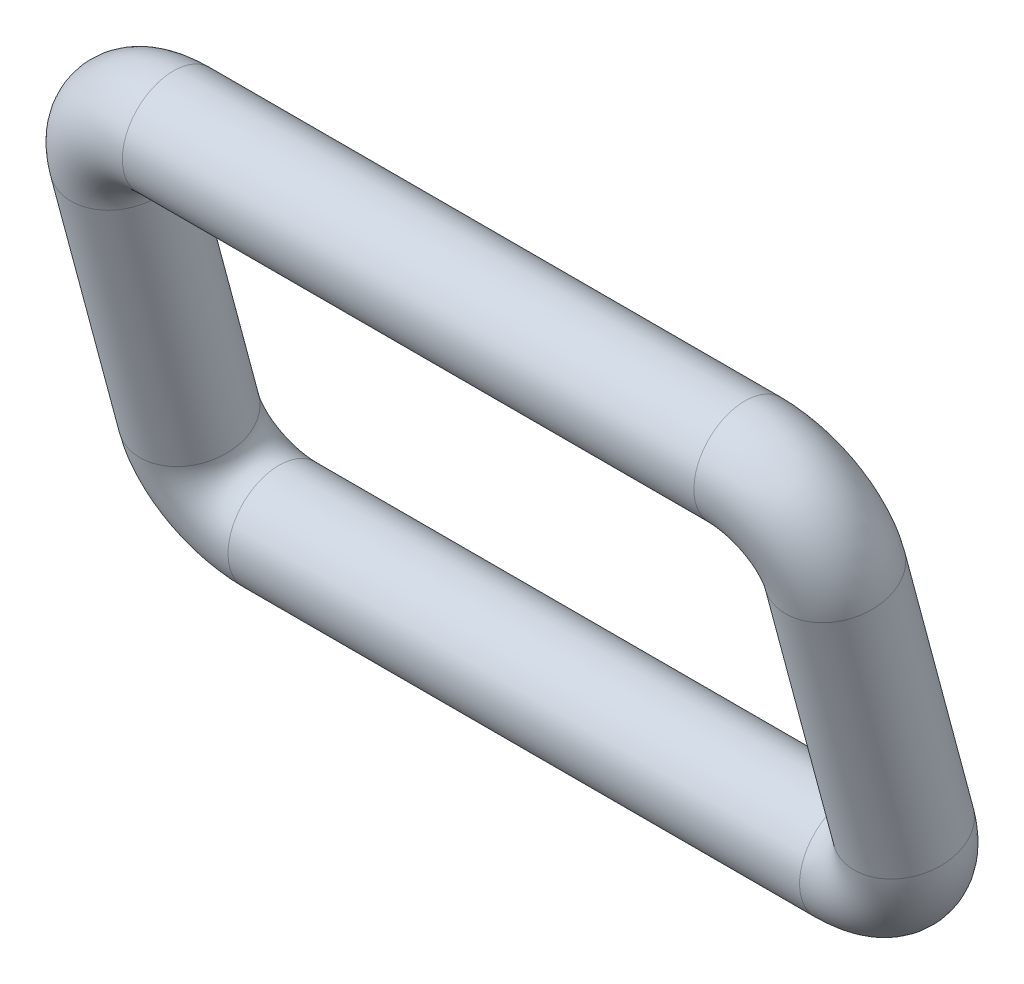
ISO-10303-21;
HEADER;
FILE_DESCRIPTION(('STEP AP214'),'2;1');
FILE_NAME('part.step','',(''),(''),'','','');
FILE_SCHEMA(('AUTOMOTIVE_DESIGN { 1 0 10303 214 1 1 1 1 }'));
ENDSEC;
DATA;
#1=APPLICATION_CONTEXT('core data for automotive mechanical design processes');
#2=APPLICATION_PROTOCOL_DEFINITION('international standard','automotive_design',2000,#1);
#3=PRODUCT_CONTEXT('',#1,'mechanical');
#4=PRODUCT('Part','Part','',(#3));
#5=PRODUCT_RELATED_PRODUCT_CATEGORY('part','',(#4));
#6=PRODUCT_DEFINITION_FORMATION('','',#4);
#7=PRODUCT_DEFINITION_CONTEXT('part definition',#1,'design');
#8=PRODUCT_DEFINITION('design','',#6,#7);
#9=PRODUCT_DEFINITION_SHAPE('','',#8);
#10=(LENGTH_UNIT() NAMED_UNIT(*) SI_UNIT(.MILLI.,.METRE.));
#11=(NAMED_UNIT(*) PLANE_ANGLE_UNIT() SI_UNIT($,.RADIAN.));
#12=(NAMED_UNIT(*) SI_UNIT($,.STERADIAN.) SOLID_ANGLE_UNIT());
#13=UNCERTAINTY_MEASURE_WITH_UNIT(LENGTH_MEASURE(1.E-05),#10,'distance_accuracy_value','');
#14=(GEOMETRIC_REPRESENTATION_CONTEXT(3) GLOBAL_UNCERTAINTY_ASSIGNED_CONTEXT((#13)) GLOBAL_UNIT_ASSIGNED_CONTEXT((#10,
#11,#12)) REPRESENTATION_CONTEXT('',''));
#15=CARTESIAN_POINT('',(0.,0.,0.));
#16=DIRECTION('',(0.,0.,1.));
#17=DIRECTION('',(1.,0.,0.));
#18=AXIS2_PLACEMENT_3D('',#15,#16,#17);
#19=CARTESIAN_POINT('',(5.24,3.03146510334378,11.4967440586326));
#20=DIRECTION('',(0.,-0.965925826289069,-0.258819045102518));
#21=DIRECTION('',(-1.,0.,0.));
#22=AXIS2_PLACEMENT_3D('',#19,#20,#21);
#23=CYLINDRICAL_SURFACE('',#22,0.6);
#24=CARTESIAN_POINT('',(5.24,0.0177765253218942,10.6892286379127));
#25=DIRECTION('',(0.,0.965925826289069,0.258819045102518));
#26=DIRECTION('',(1.,0.,0.));
#27=AXIS2_PLACEMENT_3D('',#24,#25,#26);
#28=CIRCLE('',#27,0.6);
#29=CARTESIAN_POINT('',(5.84,0.017776525321892,10.6892286379127));
#30=VERTEX_POINT('',#29);
#31=EDGE_CURVE('E96',#30,#30,#28,.T.);
#32=ORIENTED_EDGE('',*,*,#31,.T.);
#33=DIRECTION('',(0.,0.965925826289069,0.258819045102518));
#34=VECTOR('',#33,1.);
#35=CARTESIAN_POINT('',(5.84,3.03146510334378,11.4967440586326));
#36=LINE('',#35,#34);
#37=CARTESIAN_POINT('',(5.84,3.03146510334378,11.4967440586326));
#38=VERTEX_POINT('',#37);
#39=EDGE_CURVE('E11',#30,#38,#36,.T.);
#40=ORIENTED_EDGE('',*,*,#39,.T.);
#41=CARTESIAN_POINT('',(5.24,3.03146510334378,11.4967440586326));
#42=DIRECTION('',(0.,0.965925826289069,0.258819045102518));
#43=DIRECTION('',(1.,0.,0.));
#44=AXIS2_PLACEMENT_3D('',#41,#42,#43);
#45=CIRCLE('',#44,0.6);
#46=EDGE_CURVE('E109',#38,#38,#45,.T.);
#47=ORIENTED_EDGE('',*,*,#46,.F.);
#48=ORIENTED_EDGE('',*,*,#39,.F.);
#49=EDGE_LOOP('',(#32,#40,#47,#48));
#50=FACE_BOUND('',#49,.T.);
#51=ADVANCED_FACE('F16',(#50),#23,.T.);
#52=CARTESIAN_POINT('',(6.08,-0.79360116876093,10.4718206400266));
#53=DIRECTION('',(1.,0.,0.));
#54=DIRECTION('',(0.,-0.965925826289069,-0.258819045102518));
#55=AXIS2_PLACEMENT_3D('',#52,#53,#54);
#56=CYLINDRICAL_SURFACE('',#55,0.6);
#57=CARTESIAN_POINT('',(12.8,-0.79360116876093,10.4718206400266));
#58=DIRECTION('',(-1.,0.,0.));
#59=DIRECTION('',(0.,0.965925826289069,0.258819045102518));
#60=AXIS2_PLACEMENT_3D('',#57,#58,#59);
#61=CIRCLE('',#60,0.6);
#62=CARTESIAN_POINT('',(12.8,-0.214045672987487,10.6271120670881));
#63=VERTEX_POINT('',#62);
#64=EDGE_CURVE('E105',#63,#63,#61,.T.);
#65=ORIENTED_EDGE('',*,*,#64,.T.);
#66=DIRECTION('',(-1.,0.,0.));
#67=VECTOR('',#66,1.);
#68=CARTESIAN_POINT('',(6.08,-0.214045672987487,10.6271120670881));
#69=LINE('',#68,#67);
#70=CARTESIAN_POINT('',(6.08,-0.214045672987487,10.6271120670881));
#71=VERTEX_POINT('',#70);
#72=EDGE_CURVE('E27',#63,#71,#69,.T.);
#73=ORIENTED_EDGE('',*,*,#72,.T.);
#74=CARTESIAN_POINT('',(6.08,-0.79360116876093,10.4718206400266));
#75=DIRECTION('',(-1.,0.,0.));
#76=DIRECTION('',(0.,0.965925826289069,0.258819045102518));
#77=AXIS2_PLACEMENT_3D('',#74,#75,#76);
#78=CIRCLE('',#77,0.6);
#79=EDGE_CURVE('E107',#71,#71,#78,.T.);
#80=ORIENTED_EDGE('',*,*,#79,.F.);
#81=ORIENTED_EDGE('',*,*,#72,.F.);
#82=EDGE_LOOP('',(#65,#73,#80,#81));
#83=FACE_BOUND('',#82,.T.);
#84=ADVANCED_FACE('F18',(#83),#56,.T.);
#85=CARTESIAN_POINT('',(13.64,0.017776525321892,10.6892286379127));
#86=DIRECTION('',(0.,0.965925826289069,0.258819045102518));
#87=DIRECTION('',(1.,0.,0.));
#88=AXIS2_PLACEMENT_3D('',#85,#86,#87);
#89=CYLINDRICAL_SURFACE('',#88,0.6);
#90=CARTESIAN_POINT('',(13.64,3.03146510334378,11.4967440586326));
#91=DIRECTION('',(0.,-0.965925826289069,-0.258819045102518));
#92=DIRECTION('',(-1.,0.,0.));
#93=AXIS2_PLACEMENT_3D('',#90,#91,#92);
#94=CIRCLE('',#93,0.6);
#95=CARTESIAN_POINT('',(13.04,3.03146510334378,11.4967440586326));
#96=VERTEX_POINT('',#95);
#97=EDGE_CURVE('E76',#96,#96,#94,.T.);
#98=ORIENTED_EDGE('',*,*,#97,.T.);
#99=DIRECTION('',(0.,-0.965925826289069,-0.258819045102518));
#100=VECTOR('',#99,1.);
#101=CARTESIAN_POINT('',(13.04,0.017776525321892,10.6892286379127));
#102=LINE('',#101,#100);
#103=CARTESIAN_POINT('',(13.04,0.0177765253218898,10.6892286379127));
#104=VERTEX_POINT('',#103);
#105=EDGE_CURVE('E20',#96,#104,#102,.T.);
#106=ORIENTED_EDGE('',*,*,#105,.T.);
#107=CARTESIAN_POINT('',(13.64,0.017776525321892,10.6892286379127));
#108=DIRECTION('',(0.,-0.965925826289069,-0.258819045102518));
#109=DIRECTION('',(-1.,0.,0.));
#110=AXIS2_PLACEMENT_3D('',#107,#108,#109);
#111=CIRCLE('',#110,0.6);
#112=EDGE_CURVE('E78',#104,#104,#111,.T.);
#113=ORIENTED_EDGE('',*,*,#112,.F.);
#114=ORIENTED_EDGE('',*,*,#105,.F.);
#115=EDGE_LOOP('',(#98,#106,#113,#114));
#116=FACE_BOUND('',#115,.T.);
#117=ADVANCED_FACE('F74',(#116),#89,.T.);
#118=CARTESIAN_POINT('',(12.8,3.84284279742661,11.7141520565187));
#119=DIRECTION('',(-1.,0.,0.));
#120=DIRECTION('',(0.,0.965925826289069,0.258819045102518));
#121=AXIS2_PLACEMENT_3D('',#118,#119,#120);
#122=CYLINDRICAL_SURFACE('',#121,0.6);
#123=CARTESIAN_POINT('',(6.08,3.84284279742661,11.7141520565187));
#124=DIRECTION('',(1.,0.,0.));
#125=DIRECTION('',(0.,-0.965925826289069,-0.258819045102518));
#126=AXIS2_PLACEMENT_3D('',#123,#124,#125);
#127=CIRCLE('',#126,0.6);
#128=CARTESIAN_POINT('',(6.08,3.26328730165316,11.5588606294572));
#129=VERTEX_POINT('',#128);
#130=EDGE_CURVE('E86',#129,#129,#127,.T.);
#131=ORIENTED_EDGE('',*,*,#130,.T.);
#132=DIRECTION('',(1.,0.,0.));
#133=VECTOR('',#132,1.);
#134=CARTESIAN_POINT('',(12.8,3.26328730165316,11.5588606294572));
#135=LINE('',#134,#133);
#136=CARTESIAN_POINT('',(12.8,3.26328730165316,11.5588606294572));
#137=VERTEX_POINT('',#136);
#138=EDGE_CURVE('E41',#129,#137,#135,.T.);
#139=ORIENTED_EDGE('',*,*,#138,.T.);
#140=CARTESIAN_POINT('',(12.8,3.84284279742661,11.7141520565187));
#141=DIRECTION('',(1.,0.,0.));
#142=DIRECTION('',(0.,-0.965925826289069,-0.258819045102518));
#143=AXIS2_PLACEMENT_3D('',#140,#141,#142);
#144=CIRCLE('',#143,0.6);
#145=EDGE_CURVE('E98',#137,#137,#144,.T.);
#146=ORIENTED_EDGE('',*,*,#145,.F.);
#147=ORIENTED_EDGE('',*,*,#138,.F.);
#148=EDGE_LOOP('',(#131,#139,#146,#147));
#149=FACE_BOUND('',#148,.T.);
#150=ADVANCED_FACE('F160',(#149),#122,.T.);
#151=CARTESIAN_POINT('',(6.08,3.03146510334379,11.4967440586326));
#152=DIRECTION('',(0.,-0.258819045102518,0.965925826289069));
#153=DIRECTION('',(0.,-0.965925826289069,-0.258819045102518));
#154=AXIS2_PLACEMENT_3D('',#151,#152,#153);
#155=TOROIDAL_SURFACE('',#154,0.84,0.6);
#156=ORIENTED_EDGE('',*,*,#46,.T.);
#157=CARTESIAN_POINT('',(6.08,3.03146510334379,11.4967440586326));
#158=DIRECTION('',(0.,0.258819045102518,-0.965925826289069));
#159=DIRECTION('',(0.,-0.965925826289069,-0.258819045102518));
#160=AXIS2_PLACEMENT_3D('',#157,#158,#159);
#161=CIRCLE('',#160,0.24);
#162=EDGE_CURVE('E92',#38,#129,#161,.T.);
#163=ORIENTED_EDGE('',*,*,#162,.T.);
#164=ORIENTED_EDGE('',*,*,#130,.F.);
#165=ORIENTED_EDGE('',*,*,#162,.F.);
#166=EDGE_LOOP('',(#156,#163,#164,#165));
#167=FACE_BOUND('',#166,.T.);
#168=ADVANCED_FACE('F151',(#167),#155,.T.);
#169=CARTESIAN_POINT('',(6.08,0.0177765253218876,10.6892286379127));
#170=DIRECTION('',(0.,-0.258819045102518,0.965925826289069));
#171=DIRECTION('',(0.,-0.965925826289069,-0.258819045102518));
#172=AXIS2_PLACEMENT_3D('',#169,#170,#171);
#173=TOROIDAL_SURFACE('',#172,0.84,0.6);
#174=ORIENTED_EDGE('',*,*,#79,.T.);
#175=CARTESIAN_POINT('',(6.08,0.0177765253218876,10.6892286379127));
#176=DIRECTION('',(0.,0.258819045102518,-0.965925826289069));
#177=DIRECTION('',(0.,-0.965925826289069,-0.258819045102518));
#178=AXIS2_PLACEMENT_3D('',#175,#176,#177);
#179=CIRCLE('',#178,0.24);
#180=EDGE_CURVE('E122',#71,#30,#179,.T.);
#181=ORIENTED_EDGE('',*,*,#180,.T.);
#182=ORIENTED_EDGE('',*,*,#31,.F.);
#183=ORIENTED_EDGE('',*,*,#180,.F.);
#184=EDGE_LOOP('',(#174,#181,#182,#183));
#185=FACE_BOUND('',#184,.T.);
#186=ADVANCED_FACE('F149',(#185),#173,.T.);
#187=CARTESIAN_POINT('',(12.8,0.0177765253218876,10.6892286379127));
#188=DIRECTION('',(0.,-0.258819045102518,0.965925826289069));
#189=DIRECTION('',(0.,-0.965925826289069,-0.258819045102518));
#190=AXIS2_PLACEMENT_3D('',#187,#188,#189);
#191=TOROIDAL_SURFACE('',#190,0.84,0.6);
#192=ORIENTED_EDGE('',*,*,#112,.T.);
#193=CARTESIAN_POINT('',(12.8,0.0177765253218876,10.6892286379127));
#194=DIRECTION('',(0.,0.258819045102518,-0.965925826289069));
#195=DIRECTION('',(0.,-0.965925826289069,-0.258819045102518));
#196=AXIS2_PLACEMENT_3D('',#193,#194,#195);
#197=CIRCLE('',#196,0.24);
#198=EDGE_CURVE('E108',#104,#63,#197,.T.);
#199=ORIENTED_EDGE('',*,*,#198,.T.);
#200=ORIENTED_EDGE('',*,*,#64,.F.);
#201=ORIENTED_EDGE('',*,*,#198,.F.);
#202=EDGE_LOOP('',(#192,#199,#200,#201));
#203=FACE_BOUND('',#202,.T.);
#204=ADVANCED_FACE('F148',(#203),#191,.T.);
#205=CARTESIAN_POINT('',(12.8,3.03146510334379,11.4967440586326));
#206=DIRECTION('',(0.,-0.258819045102518,0.965925826289069));
#207=DIRECTION('',(0.,-0.965925826289069,-0.258819045102518));
#208=AXIS2_PLACEMENT_3D('',#205,#206,#207);
#209=TOROIDAL_SURFACE('',#208,0.84,0.6);
#210=ORIENTED_EDGE('',*,*,#145,.T.);
#211=CARTESIAN_POINT('',(12.8,3.03146510334379,11.4967440586326));
#212=DIRECTION('',(0.,0.258819045102518,-0.965925826289069));
#213=DIRECTION('',(0.,-0.965925826289069,-0.258819045102518));
#214=AXIS2_PLACEMENT_3D('',#211,#212,#213);
#215=CIRCLE('',#214,0.24);
#216=EDGE_CURVE('E101',#137,#96,#215,.T.);
#217=ORIENTED_EDGE('',*,*,#216,.T.);
#218=ORIENTED_EDGE('',*,*,#97,.F.);
#219=ORIENTED_EDGE('',*,*,#216,.F.);
#220=EDGE_LOOP('',(#210,#217,#218,#219));
#221=FACE_BOUND('',#220,.T.);
#222=ADVANCED_FACE('F158',(#221),#209,.T.);
#223=CLOSED_SHELL('',(#51,#84,#117,#150,#168,#186,#204,#222));
#224=MANIFOLD_SOLID_BREP('B1',#223);
#225=ADVANCED_BREP_SHAPE_REPRESENTATION('',(#18,#224),#14);
#226=SHAPE_DEFINITION_REPRESENTATION(#9,#225);
ENDSEC;
END-ISO-10303-21;
